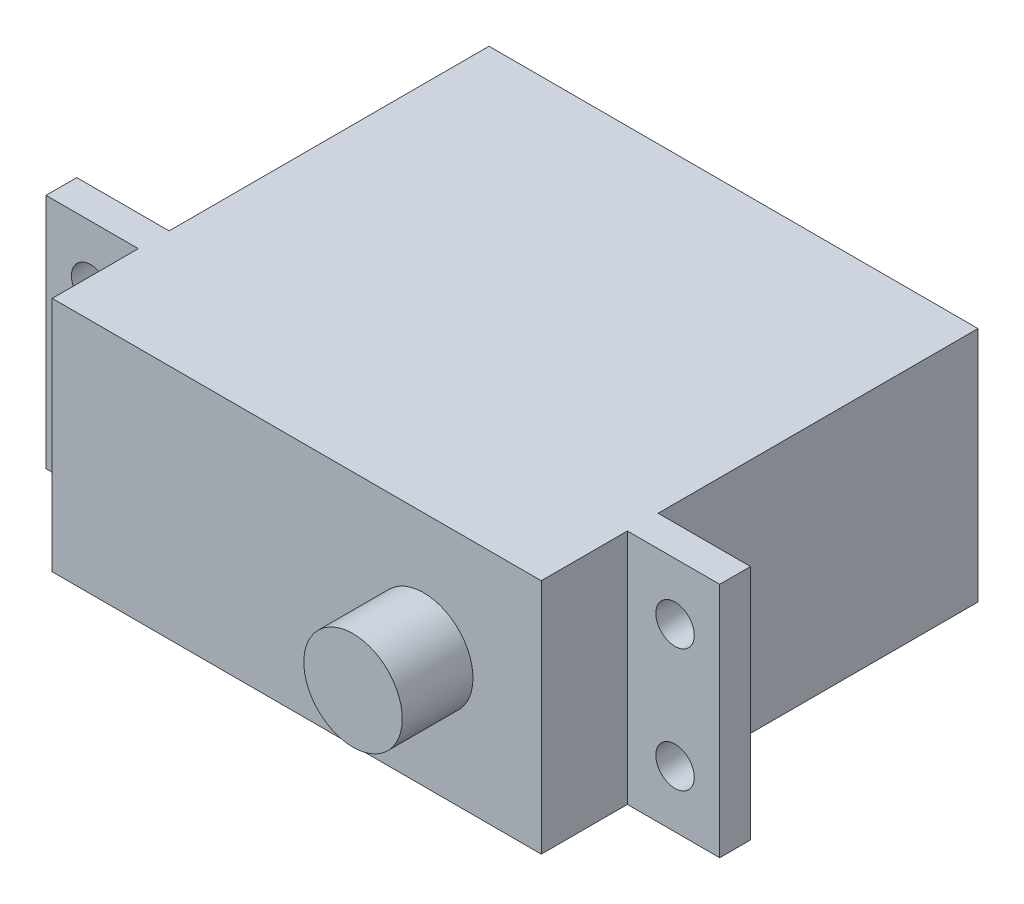
ISO-10303-21;
HEADER;
FILE_DESCRIPTION(('STEP AP214'),'2;1');
FILE_NAME('part.step','',(''),(''),'','','');
FILE_SCHEMA(('AUTOMOTIVE_DESIGN { 1 0 10303 214 1 1 1 1 }'));
ENDSEC;
DATA;
#1=APPLICATION_CONTEXT('core data for automotive mechanical design processes');
#2=APPLICATION_PROTOCOL_DEFINITION('international standard','automotive_design',2000,#1);
#3=PRODUCT_CONTEXT('',#1,'mechanical');
#4=PRODUCT('Part','Part','',(#3));
#5=PRODUCT_RELATED_PRODUCT_CATEGORY('part','',(#4));
#6=PRODUCT_DEFINITION_FORMATION('','',#4);
#7=PRODUCT_DEFINITION_CONTEXT('part definition',#1,'design');
#8=PRODUCT_DEFINITION('design','',#6,#7);
#9=PRODUCT_DEFINITION_SHAPE('','',#8);
#10=(LENGTH_UNIT() NAMED_UNIT(*) SI_UNIT(.MILLI.,.METRE.));
#11=(NAMED_UNIT(*) PLANE_ANGLE_UNIT() SI_UNIT($,.RADIAN.));
#12=(NAMED_UNIT(*) SI_UNIT($,.STERADIAN.) SOLID_ANGLE_UNIT());
#13=UNCERTAINTY_MEASURE_WITH_UNIT(LENGTH_MEASURE(1.E-05),#10,'distance_accuracy_value','');
#14=(GEOMETRIC_REPRESENTATION_CONTEXT(3) GLOBAL_UNCERTAINTY_ASSIGNED_CONTEXT((#13)) GLOBAL_UNIT_ASSIGNED_CONTEXT((#10,
#11,#12)) REPRESENTATION_CONTEXT('',''));
#15=CARTESIAN_POINT('',(0.,0.,0.));
#16=DIRECTION('',(0.,0.,1.));
#17=DIRECTION('',(1.,0.,0.));
#18=AXIS2_PLACEMENT_3D('',#15,#16,#17);
#19=CARTESIAN_POINT('',(0.,0.,36.068));
#20=DIRECTION('',(0.,0.,1.));
#21=DIRECTION('',(1.,0.,0.));
#22=AXIS2_PLACEMENT_3D('',#19,#20,#21);
#23=PLANE('',#22);
#24=DIRECTION('',(-1.,0.,0.));
#25=VECTOR('',#24,1.);
#26=CARTESIAN_POINT('',(6790.47932777844,3552.34713978667,36.068));
#27=LINE('',#26,#25);
#28=CARTESIAN_POINT('',(6790.47932777844,3552.34713978667,36.068));
#29=VERTEX_POINT('',#28);
#30=CARTESIAN_POINT('',(6750.09332777844,3552.34713978667,36.068));
#31=VERTEX_POINT('',#30);
#32=EDGE_CURVE('E214',#29,#31,#27,.T.);
#33=ORIENTED_EDGE('',*,*,#32,.T.);
#34=DIRECTION('',(0.,-1.,0.));
#35=VECTOR('',#34,1.);
#36=CARTESIAN_POINT('',(6750.09332777844,3552.34713978667,36.068));
#37=LINE('',#36,#35);
#38=CARTESIAN_POINT('',(6750.09332777844,3532.78913978667,36.068));
#39=VERTEX_POINT('',#38);
#40=EDGE_CURVE('E217',#31,#39,#37,.T.);
#41=ORIENTED_EDGE('',*,*,#40,.T.);
#42=DIRECTION('',(1.,0.,0.));
#43=VECTOR('',#42,1.);
#44=CARTESIAN_POINT('',(6750.09332777844,3532.78913978667,36.068));
#45=LINE('',#44,#43);
#46=CARTESIAN_POINT('',(6790.47932777844,3532.78913978667,36.068));
#47=VERTEX_POINT('',#46);
#48=EDGE_CURVE('E220',#39,#47,#45,.T.);
#49=ORIENTED_EDGE('',*,*,#48,.T.);
#50=DIRECTION('',(0.,1.,0.));
#51=VECTOR('',#50,1.);
#52=CARTESIAN_POINT('',(6790.47932777844,3532.78913978667,36.068));
#53=LINE('',#52,#51);
#54=EDGE_CURVE('E222',#47,#29,#53,.T.);
#55=ORIENTED_EDGE('',*,*,#54,.T.);
#56=EDGE_LOOP('',(#33,#41,#49,#55));
#57=FACE_BOUND('',#56,.T.);
#58=CARTESIAN_POINT('',(6780.77584034497,3542.56813978667,36.068));
#59=DIRECTION('',(0.,0.,1.));
#60=DIRECTION('',(1.,0.,0.));
#61=AXIS2_PLACEMENT_3D('',#58,#59,#60);
#62=CIRCLE('',#61,4.06399999999962);
#63=CARTESIAN_POINT('',(6784.83984034497,3542.56813978667,36.068));
#64=VERTEX_POINT('',#63);
#65=EDGE_CURVE('E304',#64,#64,#62,.T.);
#66=ORIENTED_EDGE('',*,*,#65,.F.);
#67=EDGE_LOOP('',(#66));
#68=FACE_BOUND('',#67,.T.);
#69=ADVANCED_FACE('F35',(#57,#68),#23,.T.);
#70=CARTESIAN_POINT('',(6750.09332777844,3552.34713978667,36.068));
#71=DIRECTION('',(1.,0.,0.));
#72=DIRECTION('',(0.,0.,-1.));
#73=AXIS2_PLACEMENT_3D('',#70,#71,#72);
#74=PLANE('',#73);
#75=DIRECTION('',(0.,1.,0.));
#76=VECTOR('',#75,1.);
#77=CARTESIAN_POINT('',(6750.09332777844,3532.78913978667,28.956));
#78=LINE('',#77,#76);
#79=CARTESIAN_POINT('',(6750.09332777844,3532.78913978667,28.956));
#80=VERTEX_POINT('',#79);
#81=CARTESIAN_POINT('',(6750.09332777844,3552.34713978667,28.956));
#82=VERTEX_POINT('',#81);
#83=EDGE_CURVE('E156',#80,#82,#78,.T.);
#84=ORIENTED_EDGE('',*,*,#83,.F.);
#85=DIRECTION('',(0.,0.,-1.));
#86=VECTOR('',#85,1.);
#87=CARTESIAN_POINT('',(6750.09332777844,3532.78913978667,36.068));
#88=LINE('',#87,#86);
#89=EDGE_CURVE('E249',#39,#80,#88,.T.);
#90=ORIENTED_EDGE('',*,*,#89,.F.);
#91=ORIENTED_EDGE('',*,*,#40,.F.);
#92=DIRECTION('',(0.,0.,-1.));
#93=VECTOR('',#92,1.);
#94=CARTESIAN_POINT('',(6750.09332777844,3552.34713978667,36.068));
#95=LINE('',#94,#93);
#96=EDGE_CURVE('E11',#31,#82,#95,.T.);
#97=ORIENTED_EDGE('',*,*,#96,.T.);
#98=EDGE_LOOP('',(#84,#90,#91,#97));
#99=FACE_BOUND('',#98,.T.);
#100=ADVANCED_FACE('F296',(#99),#74,.F.);
#101=CARTESIAN_POINT('',(6790.47932777844,3532.78913978667,36.068));
#102=DIRECTION('',(-1.,0.,0.));
#103=DIRECTION('',(0.,0.,1.));
#104=AXIS2_PLACEMENT_3D('',#101,#102,#103);
#105=PLANE('',#104);
#106=DIRECTION('',(0.,-1.,0.));
#107=VECTOR('',#106,1.);
#108=CARTESIAN_POINT('',(6790.47932777844,3532.78913978667,28.956));
#109=LINE('',#108,#107);
#110=CARTESIAN_POINT('',(6790.47932777844,3552.34713978667,28.956));
#111=VERTEX_POINT('',#110);
#112=CARTESIAN_POINT('',(6790.47932777844,3532.78913978667,28.956));
#113=VERTEX_POINT('',#112);
#114=EDGE_CURVE('E177',#111,#113,#109,.T.);
#115=ORIENTED_EDGE('',*,*,#114,.F.);
#116=DIRECTION('',(0.,0.,-1.));
#117=VECTOR('',#116,1.);
#118=CARTESIAN_POINT('',(6790.47932777844,3552.34713978667,36.068));
#119=LINE('',#118,#117);
#120=EDGE_CURVE('E240',#29,#111,#119,.T.);
#121=ORIENTED_EDGE('',*,*,#120,.F.);
#122=ORIENTED_EDGE('',*,*,#54,.F.);
#123=DIRECTION('',(0.,0.,-1.));
#124=VECTOR('',#123,1.);
#125=CARTESIAN_POINT('',(6790.47932777844,3532.78913978667,36.068));
#126=LINE('',#125,#124);
#127=EDGE_CURVE('E250',#47,#113,#126,.T.);
#128=ORIENTED_EDGE('',*,*,#127,.T.);
#129=EDGE_LOOP('',(#115,#121,#122,#128));
#130=FACE_BOUND('',#129,.T.);
#131=ADVANCED_FACE('F277',(#130),#105,.F.);
#132=CARTESIAN_POINT('',(6790.47932777844,3552.34713978667,36.068));
#133=DIRECTION('',(0.,-1.,0.));
#134=DIRECTION('',(0.,0.,-1.));
#135=AXIS2_PLACEMENT_3D('',#132,#133,#134);
#136=PLANE('',#135);
#137=DIRECTION('',(-1.,0.,0.));
#138=VECTOR('',#137,1.);
#139=CARTESIAN_POINT('',(6790.47932777844,3552.34713978667,0.));
#140=LINE('',#139,#138);
#141=CARTESIAN_POINT('',(6790.47932777844,3552.34713978667,0.));
#142=VERTEX_POINT('',#141);
#143=CARTESIAN_POINT('',(6750.09332777844,3552.34713978667,0.));
#144=VERTEX_POINT('',#143);
#145=EDGE_CURVE('E212',#142,#144,#140,.T.);
#146=ORIENTED_EDGE('',*,*,#145,.T.);
#147=CARTESIAN_POINT('',(6750.09332777844,3552.34713978667,26.416));
#148=VERTEX_POINT('',#147);
#149=EDGE_CURVE('E44',#148,#144,#95,.T.);
#150=ORIENTED_EDGE('',*,*,#149,.F.);
#151=DIRECTION('',(-1.,0.,0.));
#152=VECTOR('',#151,1.);
#153=CARTESIAN_POINT('',(6750.09332777844,3552.34713978667,26.416));
#154=LINE('',#153,#152);
#155=CARTESIAN_POINT('',(6742.46584470188,3552.34713978667,26.416));
#156=VERTEX_POINT('',#155);
#157=EDGE_CURVE('E52',#148,#156,#154,.T.);
#158=ORIENTED_EDGE('',*,*,#157,.T.);
#159=DIRECTION('',(0.,0.,1.));
#160=VECTOR('',#159,1.);
#161=CARTESIAN_POINT('',(6742.46584470188,3552.34713978667,26.416));
#162=LINE('',#161,#160);
#163=CARTESIAN_POINT('',(6742.46584470188,3552.34713978667,28.956));
#164=VERTEX_POINT('',#163);
#165=EDGE_CURVE('E128',#156,#164,#162,.T.);
#166=ORIENTED_EDGE('',*,*,#165,.T.);
#167=DIRECTION('',(-1.,0.,0.));
#168=VECTOR('',#167,1.);
#169=CARTESIAN_POINT('',(6750.09332777844,3552.34713978667,28.956));
#170=LINE('',#169,#168);
#171=EDGE_CURVE('E160',#82,#164,#170,.T.);
#172=ORIENTED_EDGE('',*,*,#171,.F.);
#173=ORIENTED_EDGE('',*,*,#96,.F.);
#174=ORIENTED_EDGE('',*,*,#32,.F.);
#175=ORIENTED_EDGE('',*,*,#120,.T.);
#176=DIRECTION('',(-1.,0.,0.));
#177=VECTOR('',#176,1.);
#178=CARTESIAN_POINT('',(6790.47932777844,3552.34713978667,28.956));
#179=LINE('',#178,#177);
#180=CARTESIAN_POINT('',(6798.106810855,3552.34713978667,28.956));
#181=VERTEX_POINT('',#180);
#182=EDGE_CURVE('E188',#181,#111,#179,.T.);
#183=ORIENTED_EDGE('',*,*,#182,.F.);
#184=DIRECTION('',(0.,0.,1.));
#185=VECTOR('',#184,1.);
#186=CARTESIAN_POINT('',(6798.106810855,3552.34713978667,26.416));
#187=LINE('',#186,#185);
#188=CARTESIAN_POINT('',(6798.106810855,3552.34713978667,26.416));
#189=VERTEX_POINT('',#188);
#190=EDGE_CURVE('E210',#189,#181,#187,.T.);
#191=ORIENTED_EDGE('',*,*,#190,.F.);
#192=DIRECTION('',(-1.,0.,0.));
#193=VECTOR('',#192,1.);
#194=CARTESIAN_POINT('',(6790.47932777844,3552.34713978667,26.416));
#195=LINE('',#194,#193);
#196=CARTESIAN_POINT('',(6790.47932777844,3552.34713978667,26.416));
#197=VERTEX_POINT('',#196);
#198=EDGE_CURVE('E195',#189,#197,#195,.T.);
#199=ORIENTED_EDGE('',*,*,#198,.T.);
#200=EDGE_CURVE('E224',#197,#142,#119,.T.);
#201=ORIENTED_EDGE('',*,*,#200,.T.);
#202=EDGE_LOOP('',(#146,#150,#158,#166,#172,#173,#174,#175,#183,#191,#199,#201));
#203=FACE_BOUND('',#202,.T.);
#204=ADVANCED_FACE('F37',(#203),#136,.F.);
#205=CARTESIAN_POINT('',(6750.09332777844,3532.78913978667,26.416));
#206=VERTEX_POINT('',#205);
#207=CARTESIAN_POINT('',(6750.09332777844,3532.78913978667,0.));
#208=VERTEX_POINT('',#207);
#209=EDGE_CURVE('E247',#206,#208,#88,.T.);
#210=ORIENTED_EDGE('',*,*,#209,.F.);
#211=DIRECTION('',(0.,1.,0.));
#212=VECTOR('',#211,1.);
#213=CARTESIAN_POINT('',(6750.09332777844,3532.78913978667,26.416));
#214=LINE('',#213,#212);
#215=EDGE_CURVE('E144',#206,#148,#214,.T.);
#216=ORIENTED_EDGE('',*,*,#215,.T.);
#217=ORIENTED_EDGE('',*,*,#149,.T.);
#218=DIRECTION('',(0.,-1.,0.));
#219=VECTOR('',#218,1.);
#220=CARTESIAN_POINT('',(6750.09332777844,3552.34713978667,0.));
#221=LINE('',#220,#219);
#222=EDGE_CURVE('E226',#144,#208,#221,.T.);
#223=ORIENTED_EDGE('',*,*,#222,.T.);
#224=EDGE_LOOP('',(#210,#216,#217,#223));
#225=FACE_BOUND('',#224,.T.);
#226=ADVANCED_FACE('F288',(#225),#74,.F.);
#227=CARTESIAN_POINT('',(6750.09332777844,3532.78913978667,36.068));
#228=DIRECTION('',(0.,1.,0.));
#229=DIRECTION('',(0.,0.,1.));
#230=AXIS2_PLACEMENT_3D('',#227,#228,#229);
#231=PLANE('',#230);
#232=DIRECTION('',(1.,0.,0.));
#233=VECTOR('',#232,1.);
#234=CARTESIAN_POINT('',(6750.09332777844,3532.78913978667,0.));
#235=LINE('',#234,#233);
#236=CARTESIAN_POINT('',(6790.47932777844,3532.78913978667,0.));
#237=VERTEX_POINT('',#236);
#238=EDGE_CURVE('E229',#208,#237,#235,.T.);
#239=ORIENTED_EDGE('',*,*,#238,.T.);
#240=CARTESIAN_POINT('',(6790.47932777844,3532.78913978667,26.416));
#241=VERTEX_POINT('',#240);
#242=EDGE_CURVE('E189',#241,#237,#126,.T.);
#243=ORIENTED_EDGE('',*,*,#242,.F.);
#244=DIRECTION('',(1.,0.,0.));
#245=VECTOR('',#244,1.);
#246=CARTESIAN_POINT('',(6798.106810855,3532.78913978667,26.416));
#247=LINE('',#246,#245);
#248=CARTESIAN_POINT('',(6798.106810855,3532.78913978667,26.416));
#249=VERTEX_POINT('',#248);
#250=EDGE_CURVE('E60',#241,#249,#247,.T.);
#251=ORIENTED_EDGE('',*,*,#250,.T.);
#252=DIRECTION('',(0.,0.,1.));
#253=VECTOR('',#252,1.);
#254=CARTESIAN_POINT('',(6798.106810855,3532.78913978667,26.416));
#255=LINE('',#254,#253);
#256=CARTESIAN_POINT('',(6798.106810855,3532.78913978667,28.956));
#257=VERTEX_POINT('',#256);
#258=EDGE_CURVE('E198',#249,#257,#255,.T.);
#259=ORIENTED_EDGE('',*,*,#258,.T.);
#260=DIRECTION('',(1.,0.,0.));
#261=VECTOR('',#260,1.);
#262=CARTESIAN_POINT('',(6798.106810855,3532.78913978667,28.956));
#263=LINE('',#262,#261);
#264=EDGE_CURVE('E203',#113,#257,#263,.T.);
#265=ORIENTED_EDGE('',*,*,#264,.F.);
#266=ORIENTED_EDGE('',*,*,#127,.F.);
#267=ORIENTED_EDGE('',*,*,#48,.F.);
#268=ORIENTED_EDGE('',*,*,#89,.T.);
#269=DIRECTION('',(1.,0.,0.));
#270=VECTOR('',#269,1.);
#271=CARTESIAN_POINT('',(6742.46584470188,3532.78913978667,28.956));
#272=LINE('',#271,#270);
#273=CARTESIAN_POINT('',(6742.46584470188,3532.78913978667,28.956));
#274=VERTEX_POINT('',#273);
#275=EDGE_CURVE('E146',#274,#80,#272,.T.);
#276=ORIENTED_EDGE('',*,*,#275,.F.);
#277=DIRECTION('',(0.,0.,1.));
#278=VECTOR('',#277,1.);
#279=CARTESIAN_POINT('',(6742.46584470188,3532.78913978667,26.416));
#280=LINE('',#279,#278);
#281=CARTESIAN_POINT('',(6742.46584470188,3532.78913978667,26.416));
#282=VERTEX_POINT('',#281);
#283=EDGE_CURVE('E136',#282,#274,#280,.T.);
#284=ORIENTED_EDGE('',*,*,#283,.F.);
#285=DIRECTION('',(1.,0.,0.));
#286=VECTOR('',#285,1.);
#287=CARTESIAN_POINT('',(6742.46584470188,3532.78913978667,26.416));
#288=LINE('',#287,#286);
#289=EDGE_CURVE('E137',#282,#206,#288,.T.);
#290=ORIENTED_EDGE('',*,*,#289,.T.);
#291=ORIENTED_EDGE('',*,*,#209,.T.);
#292=EDGE_LOOP('',(#239,#243,#251,#259,#265,#266,#267,#268,#276,#284,#290,#291));
#293=FACE_BOUND('',#292,.T.);
#294=ADVANCED_FACE('F265',(#293),#231,.F.);
#295=ORIENTED_EDGE('',*,*,#200,.F.);
#296=DIRECTION('',(0.,-1.,0.));
#297=VECTOR('',#296,1.);
#298=CARTESIAN_POINT('',(6790.47932777844,3532.78913978667,26.416));
#299=LINE('',#298,#297);
#300=EDGE_CURVE('E185',#197,#241,#299,.T.);
#301=ORIENTED_EDGE('',*,*,#300,.T.);
#302=ORIENTED_EDGE('',*,*,#242,.T.);
#303=DIRECTION('',(0.,1.,0.));
#304=VECTOR('',#303,1.);
#305=CARTESIAN_POINT('',(6790.47932777844,3532.78913978667,0.));
#306=LINE('',#305,#304);
#307=EDGE_CURVE('E218',#237,#142,#306,.T.);
#308=ORIENTED_EDGE('',*,*,#307,.T.);
#309=EDGE_LOOP('',(#295,#301,#302,#308));
#310=FACE_BOUND('',#309,.T.);
#311=ADVANCED_FACE('F279',(#310),#105,.F.);
#312=CARTESIAN_POINT('',(0.,0.,0.));
#313=DIRECTION('',(0.,0.,1.));
#314=DIRECTION('',(1.,0.,0.));
#315=AXIS2_PLACEMENT_3D('',#312,#313,#314);
#316=PLANE('',#315);
#317=ORIENTED_EDGE('',*,*,#145,.F.);
#318=ORIENTED_EDGE('',*,*,#307,.F.);
#319=ORIENTED_EDGE('',*,*,#238,.F.);
#320=ORIENTED_EDGE('',*,*,#222,.F.);
#321=EDGE_LOOP('',(#317,#318,#319,#320));
#322=FACE_BOUND('',#321,.T.);
#323=ADVANCED_FACE('F286',(#322),#316,.F.);
#324=CARTESIAN_POINT('',(6798.106810855,3552.34713978667,26.416));
#325=DIRECTION('',(1.,0.,0.));
#326=DIRECTION('',(0.,0.,-1.));
#327=AXIS2_PLACEMENT_3D('',#324,#325,#326);
#328=PLANE('',#327);
#329=DIRECTION('',(0.,1.,0.));
#330=VECTOR('',#329,1.);
#331=CARTESIAN_POINT('',(6798.106810855,3552.34713978667,28.956));
#332=LINE('',#331,#330);
#333=EDGE_CURVE('E207',#257,#181,#332,.T.);
#334=ORIENTED_EDGE('',*,*,#333,.F.);
#335=ORIENTED_EDGE('',*,*,#258,.F.);
#336=DIRECTION('',(0.,1.,0.));
#337=VECTOR('',#336,1.);
#338=CARTESIAN_POINT('',(6798.106810855,3552.34713978667,26.416));
#339=LINE('',#338,#337);
#340=EDGE_CURVE('E182',#249,#189,#339,.T.);
#341=ORIENTED_EDGE('',*,*,#340,.T.);
#342=ORIENTED_EDGE('',*,*,#190,.T.);
#343=EDGE_LOOP('',(#334,#335,#341,#342));
#344=FACE_BOUND('',#343,.T.);
#345=ADVANCED_FACE('F271',(#344),#328,.T.);
#346=CARTESIAN_POINT('',(0.,0.,26.416));
#347=DIRECTION('',(0.,0.,-1.));
#348=DIRECTION('',(-1.,0.,0.));
#349=AXIS2_PLACEMENT_3D('',#346,#347,#348);
#350=PLANE('',#349);
#351=CARTESIAN_POINT('',(6794.41632777844,3547.64813978667,26.416));
#352=DIRECTION('',(0.,0.,1.));
#353=DIRECTION('',(1.,0.,0.));
#354=AXIS2_PLACEMENT_3D('',#351,#352,#353);
#355=CIRCLE('',#354,1.5875000000003);
#356=CARTESIAN_POINT('',(6796.00382777844,3547.64813978667,26.416));
#357=VERTEX_POINT('',#356);
#358=EDGE_CURVE('E168',#357,#357,#355,.T.);
#359=ORIENTED_EDGE('',*,*,#358,.T.);
#360=EDGE_LOOP('',(#359));
#361=FACE_BOUND('',#360,.T.);
#362=CARTESIAN_POINT('',(6794.41632777844,3537.48813978667,26.416));
#363=DIRECTION('',(0.,0.,1.));
#364=DIRECTION('',(1.,0.,0.));
#365=AXIS2_PLACEMENT_3D('',#362,#363,#364);
#366=CIRCLE('',#365,1.5875000000003);
#367=CARTESIAN_POINT('',(6796.00382777844,3537.48813978667,26.416));
#368=VERTEX_POINT('',#367);
#369=EDGE_CURVE('E174',#368,#368,#366,.T.);
#370=ORIENTED_EDGE('',*,*,#369,.T.);
#371=EDGE_LOOP('',(#370));
#372=FACE_BOUND('',#371,.T.);
#373=ORIENTED_EDGE('',*,*,#300,.F.);
#374=ORIENTED_EDGE('',*,*,#198,.F.);
#375=ORIENTED_EDGE('',*,*,#340,.F.);
#376=ORIENTED_EDGE('',*,*,#250,.F.);
#377=EDGE_LOOP('',(#373,#374,#375,#376));
#378=FACE_BOUND('',#377,.T.);
#379=ADVANCED_FACE('F350',(#361,#372,#378),#350,.T.);
#380=CARTESIAN_POINT('',(0.,0.,28.956));
#381=DIRECTION('',(0.,0.,-1.));
#382=DIRECTION('',(-1.,0.,0.));
#383=AXIS2_PLACEMENT_3D('',#380,#381,#382);
#384=PLANE('',#383);
#385=CARTESIAN_POINT('',(6794.41632777844,3547.64813978667,28.956));
#386=DIRECTION('',(0.,0.,1.));
#387=DIRECTION('',(1.,0.,0.));
#388=AXIS2_PLACEMENT_3D('',#385,#386,#387);
#389=CIRCLE('',#388,1.5875000000003);
#390=CARTESIAN_POINT('',(6796.00382777844,3547.64813978667,28.956));
#391=VERTEX_POINT('',#390);
#392=EDGE_CURVE('E166',#391,#391,#389,.T.);
#393=ORIENTED_EDGE('',*,*,#392,.F.);
#394=EDGE_LOOP('',(#393));
#395=FACE_BOUND('',#394,.T.);
#396=CARTESIAN_POINT('',(6794.41632777844,3537.48813978667,28.956));
#397=DIRECTION('',(0.,0.,1.));
#398=DIRECTION('',(1.,0.,0.));
#399=AXIS2_PLACEMENT_3D('',#396,#397,#398);
#400=CIRCLE('',#399,1.5875000000003);
#401=CARTESIAN_POINT('',(6796.00382777844,3537.48813978667,28.956));
#402=VERTEX_POINT('',#401);
#403=EDGE_CURVE('E171',#402,#402,#400,.T.);
#404=ORIENTED_EDGE('',*,*,#403,.F.);
#405=EDGE_LOOP('',(#404));
#406=FACE_BOUND('',#405,.T.);
#407=ORIENTED_EDGE('',*,*,#114,.T.);
#408=ORIENTED_EDGE('',*,*,#264,.T.);
#409=ORIENTED_EDGE('',*,*,#333,.T.);
#410=ORIENTED_EDGE('',*,*,#182,.T.);
#411=EDGE_LOOP('',(#407,#408,#409,#410));
#412=FACE_BOUND('',#411,.T.);
#413=ADVANCED_FACE('F258',(#395,#406,#412),#384,.F.);
#414=CARTESIAN_POINT('',(6794.41632777844,3537.48813978667,26.416));
#415=DIRECTION('',(0.,0.,1.));
#416=DIRECTION('',(1.,0.,0.));
#417=AXIS2_PLACEMENT_3D('',#414,#415,#416);
#418=CYLINDRICAL_SURFACE('',#417,1.5875000000003);
#419=ORIENTED_EDGE('',*,*,#369,.F.);
#420=EDGE_LOOP('',(#419));
#421=FACE_BOUND('',#420,.T.);
#422=ORIENTED_EDGE('',*,*,#403,.T.);
#423=EDGE_LOOP('',(#422));
#424=FACE_BOUND('',#423,.T.);
#425=ADVANCED_FACE('F345',(#421,#424),#418,.F.);
#426=CARTESIAN_POINT('',(6794.41632777844,3547.64813978667,26.416));
#427=DIRECTION('',(0.,0.,1.));
#428=DIRECTION('',(1.,0.,0.));
#429=AXIS2_PLACEMENT_3D('',#426,#427,#428);
#430=CYLINDRICAL_SURFACE('',#429,1.5875000000003);
#431=ORIENTED_EDGE('',*,*,#358,.F.);
#432=EDGE_LOOP('',(#431));
#433=FACE_BOUND('',#432,.T.);
#434=ORIENTED_EDGE('',*,*,#392,.T.);
#435=EDGE_LOOP('',(#434));
#436=FACE_BOUND('',#435,.T.);
#437=ADVANCED_FACE('F342',(#433,#436),#430,.F.);
#438=CARTESIAN_POINT('',(6742.46584470188,3552.34713978667,26.416));
#439=DIRECTION('',(-1.,0.,0.));
#440=DIRECTION('',(0.,0.,1.));
#441=AXIS2_PLACEMENT_3D('',#438,#439,#440);
#442=PLANE('',#441);
#443=DIRECTION('',(0.,-1.,0.));
#444=VECTOR('',#443,1.);
#445=CARTESIAN_POINT('',(6742.46584470188,3552.34713978667,28.956));
#446=LINE('',#445,#444);
#447=EDGE_CURVE('E133',#164,#274,#446,.T.);
#448=ORIENTED_EDGE('',*,*,#447,.F.);
#449=ORIENTED_EDGE('',*,*,#165,.F.);
#450=DIRECTION('',(0.,-1.,0.));
#451=VECTOR('',#450,1.);
#452=CARTESIAN_POINT('',(6742.46584470188,3552.34713978667,26.416));
#453=LINE('',#452,#451);
#454=EDGE_CURVE('E130',#156,#282,#453,.T.);
#455=ORIENTED_EDGE('',*,*,#454,.T.);
#456=ORIENTED_EDGE('',*,*,#283,.T.);
#457=EDGE_LOOP('',(#448,#449,#455,#456));
#458=FACE_BOUND('',#457,.T.);
#459=ADVANCED_FACE('F129',(#458),#442,.T.);
#460=CARTESIAN_POINT('',(0.,0.,26.416));
#461=DIRECTION('',(0.,0.,1.));
#462=DIRECTION('',(1.,0.,0.));
#463=AXIS2_PLACEMENT_3D('',#460,#461,#462);
#464=PLANE('',#463);
#465=CARTESIAN_POINT('',(6746.15632777844,3537.48813978667,26.416));
#466=DIRECTION('',(0.,0.,1.));
#467=DIRECTION('',(1.,0.,0.));
#468=AXIS2_PLACEMENT_3D('',#465,#466,#467);
#469=CIRCLE('',#468,1.5875000000003);
#470=CARTESIAN_POINT('',(6747.74382777844,3537.48813978667,26.416));
#471=VERTEX_POINT('',#470);
#472=EDGE_CURVE('E312',#471,#471,#469,.T.);
#473=ORIENTED_EDGE('',*,*,#472,.T.);
#474=EDGE_LOOP('',(#473));
#475=FACE_BOUND('',#474,.T.);
#476=CARTESIAN_POINT('',(6746.15632777844,3547.64813978667,26.416));
#477=DIRECTION('',(0.,0.,1.));
#478=DIRECTION('',(1.,0.,0.));
#479=AXIS2_PLACEMENT_3D('',#476,#477,#478);
#480=CIRCLE('',#479,1.5875000000003);
#481=CARTESIAN_POINT('',(6747.74382777844,3547.64813978667,26.416));
#482=VERTEX_POINT('',#481);
#483=EDGE_CURVE('E161',#482,#482,#480,.T.);
#484=ORIENTED_EDGE('',*,*,#483,.T.);
#485=EDGE_LOOP('',(#484));
#486=FACE_BOUND('',#485,.T.);
#487=ORIENTED_EDGE('',*,*,#215,.F.);
#488=ORIENTED_EDGE('',*,*,#289,.F.);
#489=ORIENTED_EDGE('',*,*,#454,.F.);
#490=ORIENTED_EDGE('',*,*,#157,.F.);
#491=EDGE_LOOP('',(#487,#488,#489,#490));
#492=FACE_BOUND('',#491,.T.);
#493=ADVANCED_FACE('F139',(#475,#486,#492),#464,.F.);
#494=CARTESIAN_POINT('',(0.,0.,28.956));
#495=DIRECTION('',(0.,0.,1.));
#496=DIRECTION('',(1.,0.,0.));
#497=AXIS2_PLACEMENT_3D('',#494,#495,#496);
#498=PLANE('',#497);
#499=CARTESIAN_POINT('',(6746.15632777844,3537.48813978667,28.956));
#500=DIRECTION('',(0.,0.,1.));
#501=DIRECTION('',(1.,0.,0.));
#502=AXIS2_PLACEMENT_3D('',#499,#500,#501);
#503=CIRCLE('',#502,1.5875000000003);
#504=CARTESIAN_POINT('',(6747.74382777844,3537.48813978667,28.956));
#505=VERTEX_POINT('',#504);
#506=EDGE_CURVE('E309',#505,#505,#503,.T.);
#507=ORIENTED_EDGE('',*,*,#506,.F.);
#508=EDGE_LOOP('',(#507));
#509=FACE_BOUND('',#508,.T.);
#510=CARTESIAN_POINT('',(6746.15632777844,3547.64813978667,28.956));
#511=DIRECTION('',(0.,0.,1.));
#512=DIRECTION('',(1.,0.,0.));
#513=AXIS2_PLACEMENT_3D('',#510,#511,#512);
#514=CIRCLE('',#513,1.5875000000003);
#515=CARTESIAN_POINT('',(6747.74382777844,3547.64813978667,28.956));
#516=VERTEX_POINT('',#515);
#517=EDGE_CURVE('E315',#516,#516,#514,.T.);
#518=ORIENTED_EDGE('',*,*,#517,.F.);
#519=EDGE_LOOP('',(#518));
#520=FACE_BOUND('',#519,.T.);
#521=ORIENTED_EDGE('',*,*,#83,.T.);
#522=ORIENTED_EDGE('',*,*,#171,.T.);
#523=ORIENTED_EDGE('',*,*,#447,.T.);
#524=ORIENTED_EDGE('',*,*,#275,.T.);
#525=EDGE_LOOP('',(#521,#522,#523,#524));
#526=FACE_BOUND('',#525,.T.);
#527=ADVANCED_FACE('F291',(#509,#520,#526),#498,.T.);
#528=CARTESIAN_POINT('',(6746.15632777844,3547.64813978667,26.416));
#529=DIRECTION('',(0.,0.,1.));
#530=DIRECTION('',(1.,0.,0.));
#531=AXIS2_PLACEMENT_3D('',#528,#529,#530);
#532=CYLINDRICAL_SURFACE('',#531,1.5875000000003);
#533=ORIENTED_EDGE('',*,*,#483,.F.);
#534=EDGE_LOOP('',(#533));
#535=FACE_BOUND('',#534,.T.);
#536=ORIENTED_EDGE('',*,*,#517,.T.);
#537=EDGE_LOOP('',(#536));
#538=FACE_BOUND('',#537,.T.);
#539=ADVANCED_FACE('F324',(#535,#538),#532,.F.);
#540=CARTESIAN_POINT('',(6746.15632777844,3537.48813978667,26.416));
#541=DIRECTION('',(0.,0.,1.));
#542=DIRECTION('',(1.,0.,0.));
#543=AXIS2_PLACEMENT_3D('',#540,#541,#542);
#544=CYLINDRICAL_SURFACE('',#543,1.5875000000003);
#545=ORIENTED_EDGE('',*,*,#472,.F.);
#546=EDGE_LOOP('',(#545));
#547=FACE_BOUND('',#546,.T.);
#548=ORIENTED_EDGE('',*,*,#506,.T.);
#549=EDGE_LOOP('',(#548));
#550=FACE_BOUND('',#549,.T.);
#551=ADVANCED_FACE('F333',(#547,#550),#544,.F.);
#552=CARTESIAN_POINT('',(6780.77584034497,3542.56813978667,41.91));
#553=DIRECTION('',(0.,0.,-1.));
#554=DIRECTION('',(-1.,0.,0.));
#555=AXIS2_PLACEMENT_3D('',#552,#553,#554);
#556=CYLINDRICAL_SURFACE('',#555,4.06399999999962);
#557=CARTESIAN_POINT('',(6780.77584034497,3542.56813978667,41.91));
#558=DIRECTION('',(0.,0.,1.));
#559=DIRECTION('',(1.,0.,0.));
#560=AXIS2_PLACEMENT_3D('',#557,#558,#559);
#561=CIRCLE('',#560,4.06399999999962);
#562=CARTESIAN_POINT('',(6784.83984034497,3542.56813978667,41.91));
#563=VERTEX_POINT('',#562);
#564=EDGE_CURVE('E306',#563,#563,#561,.T.);
#565=ORIENTED_EDGE('',*,*,#564,.F.);
#566=EDGE_LOOP('',(#565));
#567=FACE_BOUND('',#566,.T.);
#568=ORIENTED_EDGE('',*,*,#65,.T.);
#569=EDGE_LOOP('',(#568));
#570=FACE_BOUND('',#569,.T.);
#571=ADVANCED_FACE('F460',(#567,#570),#556,.T.);
#572=CARTESIAN_POINT('',(6780.77584034497,3542.56813978667,41.91));
#573=DIRECTION('',(0.,0.,1.));
#574=DIRECTION('',(1.,0.,0.));
#575=AXIS2_PLACEMENT_3D('',#572,#573,#574);
#576=PLANE('',#575);
#577=ORIENTED_EDGE('',*,*,#564,.T.);
#578=EDGE_LOOP('',(#577));
#579=FACE_BOUND('',#578,.T.);
#580=ADVANCED_FACE('F477',(#579),#576,.T.);
#581=CLOSED_SHELL('',(#69,#100,#131,#204,#226,#294,#311,#323,#345,#379,#413,#425,#437,#459,#493,
#527,#539,#551,#571,#580));
#582=MANIFOLD_SOLID_BREP('B2',#581);
#583=ADVANCED_BREP_SHAPE_REPRESENTATION('',(#18,#582),#14);
#584=SHAPE_DEFINITION_REPRESENTATION(#9,#583);
ENDSEC;
END-ISO-10303-21;
